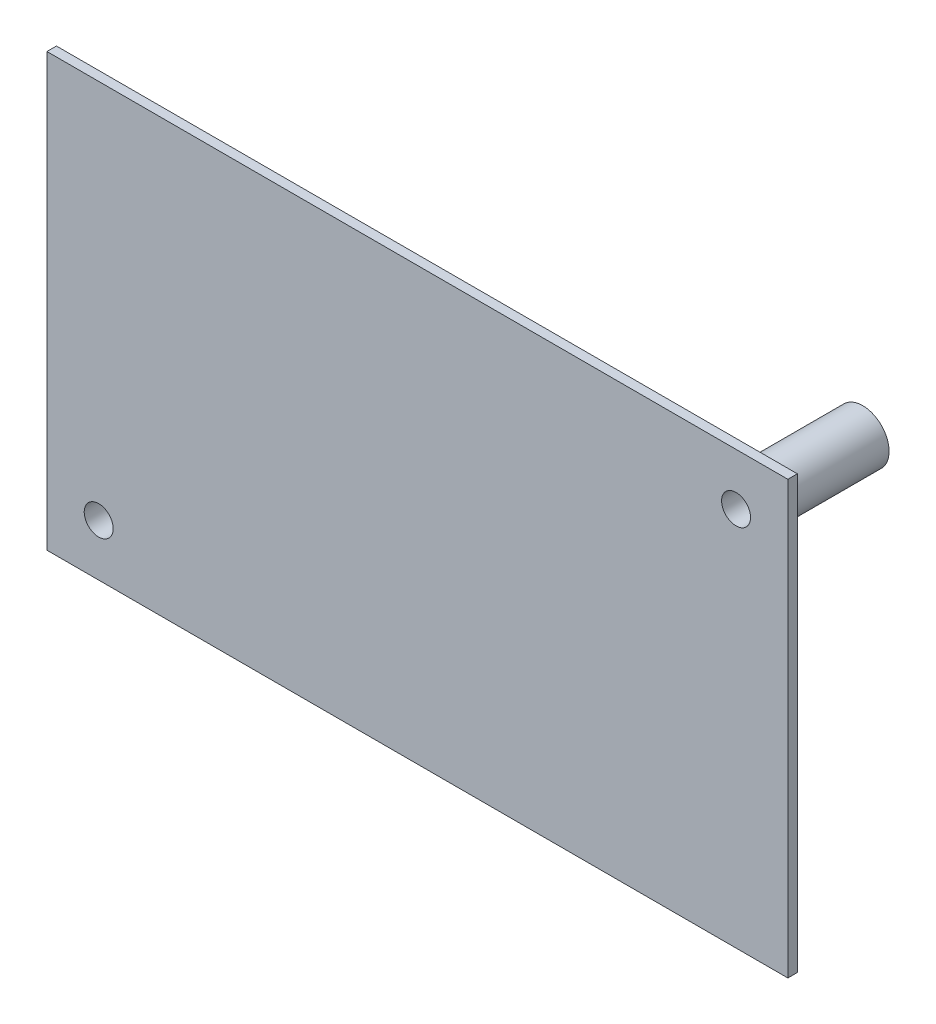
ISO-10303-21;
HEADER;
FILE_DESCRIPTION(('STEP AP214'),'2;1');
FILE_NAME('part.step','',(''),(''),'','','');
FILE_SCHEMA(('AUTOMOTIVE_DESIGN { 1 0 10303 214 1 1 1 1 }'));
ENDSEC;
DATA;
#1=APPLICATION_CONTEXT('core data for automotive mechanical design processes');
#2=APPLICATION_PROTOCOL_DEFINITION('international standard','automotive_design',2000,#1);
#3=PRODUCT_CONTEXT('',#1,'mechanical');
#4=PRODUCT('Part','Part','',(#3));
#5=PRODUCT_RELATED_PRODUCT_CATEGORY('part','',(#4));
#6=PRODUCT_DEFINITION_FORMATION('','',#4);
#7=PRODUCT_DEFINITION_CONTEXT('part definition',#1,'design');
#8=PRODUCT_DEFINITION('design','',#6,#7);
#9=PRODUCT_DEFINITION_SHAPE('','',#8);
#10=(LENGTH_UNIT() NAMED_UNIT(*) SI_UNIT(.MILLI.,.METRE.));
#11=(NAMED_UNIT(*) PLANE_ANGLE_UNIT() SI_UNIT($,.RADIAN.));
#12=(NAMED_UNIT(*) SI_UNIT($,.STERADIAN.) SOLID_ANGLE_UNIT());
#13=UNCERTAINTY_MEASURE_WITH_UNIT(LENGTH_MEASURE(1.E-05),#10,'distance_accuracy_value','');
#14=(GEOMETRIC_REPRESENTATION_CONTEXT(3) GLOBAL_UNCERTAINTY_ASSIGNED_CONTEXT((#13)) GLOBAL_UNIT_ASSIGNED_CONTEXT((#10,
#11,#12)) REPRESENTATION_CONTEXT('',''));
#15=CARTESIAN_POINT('',(0.,0.,0.));
#16=DIRECTION('',(0.,0.,1.));
#17=DIRECTION('',(1.,0.,0.));
#18=AXIS2_PLACEMENT_3D('',#15,#16,#17);
#19=CARTESIAN_POINT('',(0.5,50.3,16.25));
#20=DIRECTION('',(0.,0.,1.));
#21=DIRECTION('',(1.,0.,0.));
#22=AXIS2_PLACEMENT_3D('',#19,#20,#21);
#23=CYLINDRICAL_SURFACE('',#22,1.);
#24=CARTESIAN_POINT('',(0.5,50.3,17.));
#25=DIRECTION('',(0.,0.,1.));
#26=DIRECTION('',(1.,0.,0.));
#27=AXIS2_PLACEMENT_3D('',#24,#25,#26);
#28=CIRCLE('',#27,1.);
#29=CARTESIAN_POINT('',(0.5,51.3,17.));
#30=VERTEX_POINT('',#29);
#31=CARTESIAN_POINT('',(-0.500000000000001,50.3,17.));
#32=VERTEX_POINT('',#31);
#33=EDGE_CURVE('E143',#30,#32,#28,.T.);
#34=ORIENTED_EDGE('',*,*,#33,.F.);
#35=DIRECTION('',(0.,0.,1.));
#36=VECTOR('',#35,1.);
#37=CARTESIAN_POINT('',(0.5,51.3,16.25));
#38=LINE('',#37,#36);
#39=CARTESIAN_POINT('',(0.5,51.3,16.25));
#40=VERTEX_POINT('',#39);
#41=EDGE_CURVE('E53',#40,#30,#38,.T.);
#42=ORIENTED_EDGE('',*,*,#41,.F.);
#43=CARTESIAN_POINT('',(0.5,50.3,16.25));
#44=DIRECTION('',(0.,0.,1.));
#45=DIRECTION('',(1.,0.,0.));
#46=AXIS2_PLACEMENT_3D('',#43,#44,#45);
#47=CIRCLE('',#46,1.);
#48=CARTESIAN_POINT('',(-0.500000000000001,50.3,16.25));
#49=VERTEX_POINT('',#48);
#50=EDGE_CURVE('E173',#40,#49,#47,.T.);
#51=ORIENTED_EDGE('',*,*,#50,.T.);
#52=DIRECTION('',(0.,0.,1.));
#53=VECTOR('',#52,1.);
#54=CARTESIAN_POINT('',(-0.500000000000001,50.3,16.25));
#55=LINE('',#54,#53);
#56=EDGE_CURVE('E95',#49,#32,#55,.T.);
#57=ORIENTED_EDGE('',*,*,#56,.T.);
#58=EDGE_LOOP('',(#34,#42,#51,#57));
#59=FACE_BOUND('',#58,.T.);
#60=ADVANCED_FACE('F36',(#59),#23,.T.);
#61=CARTESIAN_POINT('',(90.94,51.3,16.25));
#62=DIRECTION('',(0.,1.,0.));
#63=DIRECTION('',(0.,0.,1.));
#64=AXIS2_PLACEMENT_3D('',#61,#62,#63);
#65=PLANE('',#64);
#66=DIRECTION('',(-1.,0.,0.));
#67=VECTOR('',#66,1.);
#68=CARTESIAN_POINT('',(90.94,51.3,17.));
#69=LINE('',#68,#67);
#70=CARTESIAN_POINT('',(90.94,51.3,17.));
#71=VERTEX_POINT('',#70);
#72=EDGE_CURVE('E169',#71,#30,#69,.T.);
#73=ORIENTED_EDGE('',*,*,#72,.F.);
#74=DIRECTION('',(0.,0.,1.));
#75=VECTOR('',#74,1.);
#76=CARTESIAN_POINT('',(90.94,51.3,16.25));
#77=LINE('',#76,#75);
#78=CARTESIAN_POINT('',(90.94,51.3,16.25));
#79=VERTEX_POINT('',#78);
#80=EDGE_CURVE('E87',#79,#71,#77,.T.);
#81=ORIENTED_EDGE('',*,*,#80,.F.);
#82=DIRECTION('',(-1.,0.,0.));
#83=VECTOR('',#82,1.);
#84=CARTESIAN_POINT('',(90.94,51.3,16.25));
#85=LINE('',#84,#83);
#86=EDGE_CURVE('E127',#79,#40,#85,.T.);
#87=ORIENTED_EDGE('',*,*,#86,.T.);
#88=ORIENTED_EDGE('',*,*,#41,.T.);
#89=EDGE_LOOP('',(#73,#81,#87,#88));
#90=FACE_BOUND('',#89,.T.);
#91=ADVANCED_FACE('F214',(#90),#65,.T.);
#92=CARTESIAN_POINT('',(90.94,50.3,16.25));
#93=DIRECTION('',(0.,0.,1.));
#94=DIRECTION('',(1.,0.,0.));
#95=AXIS2_PLACEMENT_3D('',#92,#93,#94);
#96=CYLINDRICAL_SURFACE('',#95,1.);
#97=CARTESIAN_POINT('',(90.94,50.3,17.));
#98=DIRECTION('',(0.,0.,1.));
#99=DIRECTION('',(1.,0.,0.));
#100=AXIS2_PLACEMENT_3D('',#97,#98,#99);
#101=CIRCLE('',#100,1.);
#102=CARTESIAN_POINT('',(91.94,50.3,17.));
#103=VERTEX_POINT('',#102);
#104=EDGE_CURVE('E115',#103,#71,#101,.T.);
#105=ORIENTED_EDGE('',*,*,#104,.F.);
#106=DIRECTION('',(0.,0.,1.));
#107=VECTOR('',#106,1.);
#108=CARTESIAN_POINT('',(91.94,50.3,16.25));
#109=LINE('',#108,#107);
#110=CARTESIAN_POINT('',(91.94,50.3,16.25));
#111=VERTEX_POINT('',#110);
#112=EDGE_CURVE('E81',#111,#103,#109,.T.);
#113=ORIENTED_EDGE('',*,*,#112,.F.);
#114=CARTESIAN_POINT('',(90.94,50.3,16.25));
#115=DIRECTION('',(0.,0.,1.));
#116=DIRECTION('',(1.,0.,0.));
#117=AXIS2_PLACEMENT_3D('',#114,#115,#116);
#118=CIRCLE('',#117,1.);
#119=EDGE_CURVE('E112',#111,#79,#118,.T.);
#120=ORIENTED_EDGE('',*,*,#119,.T.);
#121=ORIENTED_EDGE('',*,*,#80,.T.);
#122=EDGE_LOOP('',(#105,#113,#120,#121));
#123=FACE_BOUND('',#122,.T.);
#124=ADVANCED_FACE('F111',(#123),#96,.T.);
#125=CARTESIAN_POINT('',(91.94,0.5,16.25));
#126=DIRECTION('',(1.,0.,0.));
#127=DIRECTION('',(0.,0.,-1.));
#128=AXIS2_PLACEMENT_3D('',#125,#126,#127);
#129=PLANE('',#128);
#130=DIRECTION('',(0.,1.,0.));
#131=VECTOR('',#130,1.);
#132=CARTESIAN_POINT('',(91.94,0.5,17.));
#133=LINE('',#132,#131);
#134=CARTESIAN_POINT('',(91.94,0.5,17.));
#135=VERTEX_POINT('',#134);
#136=EDGE_CURVE('E164',#135,#103,#133,.T.);
#137=ORIENTED_EDGE('',*,*,#136,.F.);
#138=DIRECTION('',(0.,0.,1.));
#139=VECTOR('',#138,1.);
#140=CARTESIAN_POINT('',(91.94,0.5,16.25));
#141=LINE('',#140,#139);
#142=CARTESIAN_POINT('',(91.94,0.5,16.25));
#143=VERTEX_POINT('',#142);
#144=EDGE_CURVE('E118',#143,#135,#141,.T.);
#145=ORIENTED_EDGE('',*,*,#144,.F.);
#146=DIRECTION('',(0.,1.,0.));
#147=VECTOR('',#146,1.);
#148=CARTESIAN_POINT('',(91.94,0.5,16.25));
#149=LINE('',#148,#147);
#150=EDGE_CURVE('E124',#143,#111,#149,.T.);
#151=ORIENTED_EDGE('',*,*,#150,.T.);
#152=ORIENTED_EDGE('',*,*,#112,.T.);
#153=EDGE_LOOP('',(#137,#145,#151,#152));
#154=FACE_BOUND('',#153,.T.);
#155=ADVANCED_FACE('F130',(#154),#129,.T.);
#156=CARTESIAN_POINT('',(90.94,0.5,16.25));
#157=DIRECTION('',(0.,0.,1.));
#158=DIRECTION('',(1.,0.,0.));
#159=AXIS2_PLACEMENT_3D('',#156,#157,#158);
#160=CYLINDRICAL_SURFACE('',#159,1.);
#161=CARTESIAN_POINT('',(90.94,0.5,17.));
#162=DIRECTION('',(0.,0.,1.));
#163=DIRECTION('',(1.,0.,0.));
#164=AXIS2_PLACEMENT_3D('',#161,#162,#163);
#165=CIRCLE('',#164,1.);
#166=CARTESIAN_POINT('',(90.94,-0.500000000000001,17.));
#167=VERTEX_POINT('',#166);
#168=EDGE_CURVE('E160',#167,#135,#165,.T.);
#169=ORIENTED_EDGE('',*,*,#168,.F.);
#170=DIRECTION('',(0.,0.,1.));
#171=VECTOR('',#170,1.);
#172=CARTESIAN_POINT('',(90.94,-0.500000000000001,16.25));
#173=LINE('',#172,#171);
#174=CARTESIAN_POINT('',(90.94,-0.500000000000001,16.25));
#175=VERTEX_POINT('',#174);
#176=EDGE_CURVE('E179',#175,#167,#173,.T.);
#177=ORIENTED_EDGE('',*,*,#176,.F.);
#178=CARTESIAN_POINT('',(90.94,0.5,16.25));
#179=DIRECTION('',(0.,0.,1.));
#180=DIRECTION('',(1.,0.,0.));
#181=AXIS2_PLACEMENT_3D('',#178,#179,#180);
#182=CIRCLE('',#181,1.);
#183=EDGE_CURVE('E132',#175,#143,#182,.T.);
#184=ORIENTED_EDGE('',*,*,#183,.T.);
#185=ORIENTED_EDGE('',*,*,#144,.T.);
#186=EDGE_LOOP('',(#169,#177,#184,#185));
#187=FACE_BOUND('',#186,.T.);
#188=ADVANCED_FACE('F224',(#187),#160,.T.);
#189=CARTESIAN_POINT('',(0.500000000000019,-0.5,16.25));
#190=DIRECTION('',(0.,-1.,0.));
#191=DIRECTION('',(1.,0.,0.));
#192=AXIS2_PLACEMENT_3D('',#189,#190,#191);
#193=PLANE('',#192);
#194=DIRECTION('',(1.,0.,0.));
#195=VECTOR('',#194,1.);
#196=CARTESIAN_POINT('',(0.500000000000019,-0.5,17.));
#197=LINE('',#196,#195);
#198=CARTESIAN_POINT('',(0.500000000000019,-0.5,17.));
#199=VERTEX_POINT('',#198);
#200=EDGE_CURVE('E156',#199,#167,#197,.T.);
#201=ORIENTED_EDGE('',*,*,#200,.F.);
#202=DIRECTION('',(0.,0.,1.));
#203=VECTOR('',#202,1.);
#204=CARTESIAN_POINT('',(0.500000000000019,-0.5,16.25));
#205=LINE('',#204,#203);
#206=CARTESIAN_POINT('',(0.500000000000019,-0.5,16.25));
#207=VERTEX_POINT('',#206);
#208=EDGE_CURVE('E182',#207,#199,#205,.T.);
#209=ORIENTED_EDGE('',*,*,#208,.F.);
#210=DIRECTION('',(1.,0.,0.));
#211=VECTOR('',#210,1.);
#212=CARTESIAN_POINT('',(0.500000000000019,-0.5,16.25));
#213=LINE('',#212,#211);
#214=EDGE_CURVE('E137',#207,#175,#213,.T.);
#215=ORIENTED_EDGE('',*,*,#214,.T.);
#216=ORIENTED_EDGE('',*,*,#176,.T.);
#217=EDGE_LOOP('',(#201,#209,#215,#216));
#218=FACE_BOUND('',#217,.T.);
#219=ADVANCED_FACE('F230',(#218),#193,.T.);
#220=CARTESIAN_POINT('',(0.5,0.5,16.25));
#221=DIRECTION('',(0.,0.,1.));
#222=DIRECTION('',(1.,0.,0.));
#223=AXIS2_PLACEMENT_3D('',#220,#221,#222);
#224=CYLINDRICAL_SURFACE('',#223,1.);
#225=CARTESIAN_POINT('',(0.5,0.5,17.));
#226=DIRECTION('',(0.,0.,1.));
#227=DIRECTION('',(1.,0.,0.));
#228=AXIS2_PLACEMENT_3D('',#225,#226,#227);
#229=CIRCLE('',#228,1.);
#230=CARTESIAN_POINT('',(-0.5,0.5,17.));
#231=VERTEX_POINT('',#230);
#232=EDGE_CURVE('E152',#231,#199,#229,.T.);
#233=ORIENTED_EDGE('',*,*,#232,.F.);
#234=DIRECTION('',(0.,0.,1.));
#235=VECTOR('',#234,1.);
#236=CARTESIAN_POINT('',(-0.5,0.5,16.25));
#237=LINE('',#236,#235);
#238=CARTESIAN_POINT('',(-0.5,0.5,16.25));
#239=VERTEX_POINT('',#238);
#240=EDGE_CURVE('E185',#239,#231,#237,.T.);
#241=ORIENTED_EDGE('',*,*,#240,.F.);
#242=CARTESIAN_POINT('',(0.5,0.5,16.25));
#243=DIRECTION('',(0.,0.,1.));
#244=DIRECTION('',(1.,0.,0.));
#245=AXIS2_PLACEMENT_3D('',#242,#243,#244);
#246=CIRCLE('',#245,1.);
#247=EDGE_CURVE('E232',#239,#207,#246,.T.);
#248=ORIENTED_EDGE('',*,*,#247,.T.);
#249=ORIENTED_EDGE('',*,*,#208,.T.);
#250=EDGE_LOOP('',(#233,#241,#248,#249));
#251=FACE_BOUND('',#250,.T.);
#252=ADVANCED_FACE('F209',(#251),#224,.T.);
#253=CARTESIAN_POINT('',(-0.500000000000001,50.3,16.25));
#254=DIRECTION('',(-1.,0.,0.));
#255=DIRECTION('',(0.,-1.,0.));
#256=AXIS2_PLACEMENT_3D('',#253,#254,#255);
#257=PLANE('',#256);
#258=DIRECTION('',(0.,-1.,0.));
#259=VECTOR('',#258,1.);
#260=CARTESIAN_POINT('',(-0.500000000000001,50.3,17.));
#261=LINE('',#260,#259);
#262=EDGE_CURVE('E147',#32,#231,#261,.T.);
#263=ORIENTED_EDGE('',*,*,#262,.F.);
#264=ORIENTED_EDGE('',*,*,#56,.F.);
#265=DIRECTION('',(0.,-1.,0.));
#266=VECTOR('',#265,1.);
#267=CARTESIAN_POINT('',(-0.500000000000001,50.3,16.25));
#268=LINE('',#267,#266);
#269=EDGE_CURVE('E236',#49,#239,#268,.T.);
#270=ORIENTED_EDGE('',*,*,#269,.T.);
#271=ORIENTED_EDGE('',*,*,#240,.T.);
#272=EDGE_LOOP('',(#263,#264,#270,#271));
#273=FACE_BOUND('',#272,.T.);
#274=ADVANCED_FACE('F199',(#273),#257,.T.);
#275=CARTESIAN_POINT('',(0.5,50.3,16.25));
#276=DIRECTION('',(0.,0.,1.));
#277=DIRECTION('',(1.,0.,0.));
#278=AXIS2_PLACEMENT_3D('',#275,#276,#277);
#279=PLANE('',#278);
#280=CARTESIAN_POINT('',(87.63,46.99,16.2500000000136));
#281=DIRECTION('',(0.,0.,1.));
#282=DIRECTION('',(1.,0.,0.));
#283=AXIS2_PLACEMENT_3D('',#280,#281,#282);
#284=CIRCLE('',#283,3.47265624999999);
#285=CARTESIAN_POINT('',(91.10265625,46.99,16.2500000000136));
#286=VERTEX_POINT('',#285);
#287=EDGE_CURVE('E11',#286,#286,#284,.F.);
#288=ORIENTED_EDGE('',*,*,#287,.F.);
#289=EDGE_LOOP('',(#288));
#290=FACE_BOUND('',#289,.T.);
#291=CARTESIAN_POINT('',(3.81,3.81,16.2500000000136));
#292=DIRECTION('',(0.,0.,1.));
#293=DIRECTION('',(1.,0.,0.));
#294=AXIS2_PLACEMENT_3D('',#291,#292,#293);
#295=CIRCLE('',#294,3.47265625);
#296=CARTESIAN_POINT('',(7.28265625,3.81,16.2500000000136));
#297=VERTEX_POINT('',#296);
#298=EDGE_CURVE('E45',#297,#297,#295,.F.);
#299=ORIENTED_EDGE('',*,*,#298,.F.);
#300=EDGE_LOOP('',(#299));
#301=FACE_BOUND('',#300,.T.);
#302=ORIENTED_EDGE('',*,*,#50,.F.);
#303=ORIENTED_EDGE('',*,*,#86,.F.);
#304=ORIENTED_EDGE('',*,*,#119,.F.);
#305=ORIENTED_EDGE('',*,*,#150,.F.);
#306=ORIENTED_EDGE('',*,*,#183,.F.);
#307=ORIENTED_EDGE('',*,*,#214,.F.);
#308=ORIENTED_EDGE('',*,*,#247,.F.);
#309=ORIENTED_EDGE('',*,*,#269,.F.);
#310=EDGE_LOOP('',(#302,#303,#304,#305,#306,#307,#308,#309));
#311=FACE_BOUND('',#310,.T.);
#312=ADVANCED_FACE('F122',(#290,#301,#311),#279,.F.);
#313=CARTESIAN_POINT('',(0.,0.,17.));
#314=DIRECTION('',(0.,0.,1.));
#315=DIRECTION('',(1.,0.,0.));
#316=AXIS2_PLACEMENT_3D('',#313,#314,#315);
#317=PLANE('',#316);
#318=DIRECTION('',(1.,0.,0.));
#319=VECTOR('',#318,1.);
#320=CARTESIAN_POINT('',(-3.00000000000001,-3.,17.));
#321=LINE('',#320,#319);
#322=CARTESIAN_POINT('',(-3.00000000000001,-3.,17.));
#323=VERTEX_POINT('',#322);
#324=CARTESIAN_POINT('',(94.44,-3.,17.));
#325=VERTEX_POINT('',#324);
#326=EDGE_CURVE('E269',#323,#325,#321,.T.);
#327=ORIENTED_EDGE('',*,*,#326,.F.);
#328=DIRECTION('',(0.,-1.,0.));
#329=VECTOR('',#328,1.);
#330=CARTESIAN_POINT('',(-3.00000000000001,53.8,17.));
#331=LINE('',#330,#329);
#332=CARTESIAN_POINT('',(-3.00000000000001,53.8,17.));
#333=VERTEX_POINT('',#332);
#334=EDGE_CURVE('E257',#333,#323,#331,.T.);
#335=ORIENTED_EDGE('',*,*,#334,.F.);
#336=DIRECTION('',(-1.,0.,0.));
#337=VECTOR('',#336,1.);
#338=CARTESIAN_POINT('',(94.44,53.8,17.));
#339=LINE('',#338,#337);
#340=CARTESIAN_POINT('',(94.44,53.8,17.));
#341=VERTEX_POINT('',#340);
#342=EDGE_CURVE('E261',#341,#333,#339,.T.);
#343=ORIENTED_EDGE('',*,*,#342,.F.);
#344=DIRECTION('',(0.,1.,0.));
#345=VECTOR('',#344,1.);
#346=CARTESIAN_POINT('',(94.44,-3.,17.));
#347=LINE('',#346,#345);
#348=EDGE_CURVE('E265',#325,#341,#347,.T.);
#349=ORIENTED_EDGE('',*,*,#348,.F.);
#350=EDGE_LOOP('',(#327,#335,#343,#349));
#351=FACE_BOUND('',#350,.T.);
#352=ORIENTED_EDGE('',*,*,#72,.T.);
#353=ORIENTED_EDGE('',*,*,#33,.T.);
#354=ORIENTED_EDGE('',*,*,#262,.T.);
#355=ORIENTED_EDGE('',*,*,#232,.T.);
#356=ORIENTED_EDGE('',*,*,#200,.T.);
#357=ORIENTED_EDGE('',*,*,#168,.T.);
#358=ORIENTED_EDGE('',*,*,#136,.T.);
#359=ORIENTED_EDGE('',*,*,#104,.T.);
#360=EDGE_LOOP('',(#352,#353,#354,#355,#356,#357,#358,#359));
#361=FACE_BOUND('',#360,.T.);
#362=ADVANCED_FACE('F198',(#351,#361),#317,.F.);
#363=CARTESIAN_POINT('',(-3.00000000000001,-3.,18.25));
#364=DIRECTION('',(0.,1.,0.));
#365=DIRECTION('',(0.,0.,1.));
#366=AXIS2_PLACEMENT_3D('',#363,#364,#365);
#367=PLANE('',#366);
#368=ORIENTED_EDGE('',*,*,#326,.T.);
#369=DIRECTION('',(0.,0.,-1.));
#370=VECTOR('',#369,1.);
#371=CARTESIAN_POINT('',(94.44,-3.,18.25));
#372=LINE('',#371,#370);
#373=CARTESIAN_POINT('',(94.44,-3.,18.25));
#374=VERTEX_POINT('',#373);
#375=EDGE_CURVE('E148',#374,#325,#372,.T.);
#376=ORIENTED_EDGE('',*,*,#375,.F.);
#377=DIRECTION('',(1.,0.,0.));
#378=VECTOR('',#377,1.);
#379=CARTESIAN_POINT('',(-3.00000000000001,-3.,18.25));
#380=LINE('',#379,#378);
#381=CARTESIAN_POINT('',(-3.00000000000001,-3.,18.25));
#382=VERTEX_POINT('',#381);
#383=EDGE_CURVE('E260',#382,#374,#380,.T.);
#384=ORIENTED_EDGE('',*,*,#383,.F.);
#385=DIRECTION('',(0.,0.,-1.));
#386=VECTOR('',#385,1.);
#387=CARTESIAN_POINT('',(-3.00000000000001,-3.,18.25));
#388=LINE('',#387,#386);
#389=EDGE_CURVE('E252',#382,#323,#388,.T.);
#390=ORIENTED_EDGE('',*,*,#389,.T.);
#391=EDGE_LOOP('',(#368,#376,#384,#390));
#392=FACE_BOUND('',#391,.T.);
#393=ADVANCED_FACE('F206',(#392),#367,.F.);
#394=CARTESIAN_POINT('',(94.44,-3.,18.25));
#395=DIRECTION('',(-1.,0.,0.));
#396=DIRECTION('',(0.,0.,1.));
#397=AXIS2_PLACEMENT_3D('',#394,#395,#396);
#398=PLANE('',#397);
#399=ORIENTED_EDGE('',*,*,#348,.T.);
#400=DIRECTION('',(0.,0.,-1.));
#401=VECTOR('',#400,1.);
#402=CARTESIAN_POINT('',(94.44,53.8,18.25));
#403=LINE('',#402,#401);
#404=CARTESIAN_POINT('',(94.44,53.8,18.25));
#405=VERTEX_POINT('',#404);
#406=EDGE_CURVE('E244',#405,#341,#403,.T.);
#407=ORIENTED_EDGE('',*,*,#406,.F.);
#408=DIRECTION('',(0.,1.,0.));
#409=VECTOR('',#408,1.);
#410=CARTESIAN_POINT('',(94.44,-3.,18.25));
#411=LINE('',#410,#409);
#412=EDGE_CURVE('E280',#374,#405,#411,.T.);
#413=ORIENTED_EDGE('',*,*,#412,.F.);
#414=ORIENTED_EDGE('',*,*,#375,.T.);
#415=EDGE_LOOP('',(#399,#407,#413,#414));
#416=FACE_BOUND('',#415,.T.);
#417=ADVANCED_FACE('F345',(#416),#398,.F.);
#418=CARTESIAN_POINT('',(94.44,53.8,18.25));
#419=DIRECTION('',(0.,-1.,0.));
#420=DIRECTION('',(0.,0.,-1.));
#421=AXIS2_PLACEMENT_3D('',#418,#419,#420);
#422=PLANE('',#421);
#423=ORIENTED_EDGE('',*,*,#342,.T.);
#424=DIRECTION('',(0.,0.,-1.));
#425=VECTOR('',#424,1.);
#426=CARTESIAN_POINT('',(-3.00000000000001,53.8,18.25));
#427=LINE('',#426,#425);
#428=CARTESIAN_POINT('',(-3.00000000000001,53.8,18.25));
#429=VERTEX_POINT('',#428);
#430=EDGE_CURVE('E248',#429,#333,#427,.T.);
#431=ORIENTED_EDGE('',*,*,#430,.F.);
#432=DIRECTION('',(-1.,0.,0.));
#433=VECTOR('',#432,1.);
#434=CARTESIAN_POINT('',(94.44,53.8,18.25));
#435=LINE('',#434,#433);
#436=EDGE_CURVE('E276',#405,#429,#435,.T.);
#437=ORIENTED_EDGE('',*,*,#436,.F.);
#438=ORIENTED_EDGE('',*,*,#406,.T.);
#439=EDGE_LOOP('',(#423,#431,#437,#438));
#440=FACE_BOUND('',#439,.T.);
#441=ADVANCED_FACE('F339',(#440),#422,.F.);
#442=CARTESIAN_POINT('',(-3.00000000000001,53.8,18.25));
#443=DIRECTION('',(1.,0.,0.));
#444=DIRECTION('',(0.,0.,-1.));
#445=AXIS2_PLACEMENT_3D('',#442,#443,#444);
#446=PLANE('',#445);
#447=ORIENTED_EDGE('',*,*,#334,.T.);
#448=ORIENTED_EDGE('',*,*,#389,.F.);
#449=DIRECTION('',(0.,-1.,0.));
#450=VECTOR('',#449,1.);
#451=CARTESIAN_POINT('',(-3.00000000000001,53.8,18.25));
#452=LINE('',#451,#450);
#453=EDGE_CURVE('E256',#429,#382,#452,.T.);
#454=ORIENTED_EDGE('',*,*,#453,.F.);
#455=ORIENTED_EDGE('',*,*,#430,.T.);
#456=EDGE_LOOP('',(#447,#448,#454,#455));
#457=FACE_BOUND('',#456,.T.);
#458=ADVANCED_FACE('F331',(#457),#446,.F.);
#459=CARTESIAN_POINT('',(0.,0.,18.25));
#460=DIRECTION('',(0.,0.,1.));
#461=DIRECTION('',(1.,0.,0.));
#462=AXIS2_PLACEMENT_3D('',#459,#460,#461);
#463=PLANE('',#462);
#464=CARTESIAN_POINT('',(3.81,3.81,18.25));
#465=DIRECTION('',(0.,0.,1.));
#466=DIRECTION('',(1.,0.,0.));
#467=AXIS2_PLACEMENT_3D('',#464,#465,#466);
#468=CIRCLE('',#467,1.905);
#469=CARTESIAN_POINT('',(5.715,3.81,18.25));
#470=VERTEX_POINT('',#469);
#471=EDGE_CURVE('E298',#470,#470,#468,.F.);
#472=ORIENTED_EDGE('',*,*,#471,.T.);
#473=EDGE_LOOP('',(#472));
#474=FACE_BOUND('',#473,.T.);
#475=CARTESIAN_POINT('',(87.63,46.99,18.25));
#476=DIRECTION('',(0.,0.,1.));
#477=DIRECTION('',(1.,0.,0.));
#478=AXIS2_PLACEMENT_3D('',#475,#476,#477);
#479=CIRCLE('',#478,1.90500000000001);
#480=CARTESIAN_POINT('',(89.535,46.99,18.25));
#481=VERTEX_POINT('',#480);
#482=EDGE_CURVE('E302',#481,#481,#479,.F.);
#483=ORIENTED_EDGE('',*,*,#482,.T.);
#484=EDGE_LOOP('',(#483));
#485=FACE_BOUND('',#484,.T.);
#486=ORIENTED_EDGE('',*,*,#383,.T.);
#487=ORIENTED_EDGE('',*,*,#412,.T.);
#488=ORIENTED_EDGE('',*,*,#436,.T.);
#489=ORIENTED_EDGE('',*,*,#453,.T.);
#490=EDGE_LOOP('',(#486,#487,#488,#489));
#491=FACE_BOUND('',#490,.T.);
#492=ADVANCED_FACE('F310',(#474,#485,#491),#463,.T.);
#493=CARTESIAN_POINT('',(3.81,3.81,1.6));
#494=DIRECTION('',(0.,0.,1.));
#495=DIRECTION('',(1.,0.,0.));
#496=AXIS2_PLACEMENT_3D('',#493,#494,#495);
#497=PLANE('',#496);
#498=CARTESIAN_POINT('',(3.81,3.81,1.6));
#499=DIRECTION('',(0.,0.,1.));
#500=DIRECTION('',(1.,0.,0.));
#501=AXIS2_PLACEMENT_3D('',#498,#499,#500);
#502=CIRCLE('',#501,1.905);
#503=CARTESIAN_POINT('',(5.715,3.81,1.6));
#504=VERTEX_POINT('',#503);
#505=EDGE_CURVE('E287',#504,#504,#502,.T.);
#506=ORIENTED_EDGE('',*,*,#505,.T.);
#507=EDGE_LOOP('',(#506));
#508=FACE_BOUND('',#507,.T.);
#509=CARTESIAN_POINT('',(3.81,3.81,1.6));
#510=DIRECTION('',(0.,0.,1.));
#511=DIRECTION('',(1.,0.,0.));
#512=AXIS2_PLACEMENT_3D('',#509,#510,#511);
#513=CIRCLE('',#512,3.47265625);
#514=CARTESIAN_POINT('',(7.28265625,3.81,1.6));
#515=VERTEX_POINT('',#514);
#516=EDGE_CURVE('E272',#515,#515,#513,.T.);
#517=ORIENTED_EDGE('',*,*,#516,.F.);
#518=EDGE_LOOP('',(#517));
#519=FACE_BOUND('',#518,.T.);
#520=ADVANCED_FACE('F325',(#508,#519),#497,.F.);
#521=CARTESIAN_POINT('',(3.81,3.81,500000.));
#522=DIRECTION('',(0.,0.,-1.));
#523=DIRECTION('',(-1.,0.,0.));
#524=AXIS2_PLACEMENT_3D('',#521,#522,#523);
#525=CYLINDRICAL_SURFACE('',#524,3.47265625);
#526=ORIENTED_EDGE('',*,*,#516,.T.);
#527=EDGE_LOOP('',(#526));
#528=FACE_BOUND('',#527,.T.);
#529=ORIENTED_EDGE('',*,*,#298,.T.);
#530=EDGE_LOOP('',(#529));
#531=FACE_BOUND('',#530,.T.);
#532=ADVANCED_FACE('F195',(#528,#531),#525,.T.);
#533=CARTESIAN_POINT('',(3.81,3.81,500000.));
#534=DIRECTION('',(0.,0.,-1.));
#535=DIRECTION('',(-1.,0.,0.));
#536=AXIS2_PLACEMENT_3D('',#533,#534,#535);
#537=CYLINDRICAL_SURFACE('',#536,1.905);
#538=ORIENTED_EDGE('',*,*,#505,.F.);
#539=EDGE_LOOP('',(#538));
#540=FACE_BOUND('',#539,.T.);
#541=ORIENTED_EDGE('',*,*,#471,.F.);
#542=EDGE_LOOP('',(#541));
#543=FACE_BOUND('',#542,.T.);
#544=ADVANCED_FACE('F313',(#540,#543),#537,.F.);
#545=CARTESIAN_POINT('',(87.63,46.99,1.6));
#546=DIRECTION('',(0.,0.,1.));
#547=DIRECTION('',(1.,0.,0.));
#548=AXIS2_PLACEMENT_3D('',#545,#546,#547);
#549=PLANE('',#548);
#550=CARTESIAN_POINT('',(87.63,46.99,1.6));
#551=DIRECTION('',(0.,0.,1.));
#552=DIRECTION('',(1.,0.,0.));
#553=AXIS2_PLACEMENT_3D('',#550,#551,#552);
#554=CIRCLE('',#553,1.90500000000001);
#555=CARTESIAN_POINT('',(89.535,46.99,1.6));
#556=VERTEX_POINT('',#555);
#557=EDGE_CURVE('E295',#556,#556,#554,.T.);
#558=ORIENTED_EDGE('',*,*,#557,.T.);
#559=EDGE_LOOP('',(#558));
#560=FACE_BOUND('',#559,.T.);
#561=CARTESIAN_POINT('',(87.63,46.99,1.6));
#562=DIRECTION('',(0.,0.,1.));
#563=DIRECTION('',(1.,0.,0.));
#564=AXIS2_PLACEMENT_3D('',#561,#562,#563);
#565=CIRCLE('',#564,3.47265624999999);
#566=CARTESIAN_POINT('',(91.10265625,46.99,1.6));
#567=VERTEX_POINT('',#566);
#568=EDGE_CURVE('E291',#567,#567,#565,.T.);
#569=ORIENTED_EDGE('',*,*,#568,.F.);
#570=EDGE_LOOP('',(#569));
#571=FACE_BOUND('',#570,.T.);
#572=ADVANCED_FACE('F315',(#560,#571),#549,.F.);
#573=CARTESIAN_POINT('',(87.63,46.99,500000.));
#574=DIRECTION('',(0.,0.,-1.));
#575=DIRECTION('',(-1.,0.,0.));
#576=AXIS2_PLACEMENT_3D('',#573,#574,#575);
#577=CYLINDRICAL_SURFACE('',#576,3.47265624999999);
#578=ORIENTED_EDGE('',*,*,#568,.T.);
#579=EDGE_LOOP('',(#578));
#580=FACE_BOUND('',#579,.T.);
#581=ORIENTED_EDGE('',*,*,#287,.T.);
#582=EDGE_LOOP('',(#581));
#583=FACE_BOUND('',#582,.T.);
#584=ADVANCED_FACE('F322',(#580,#583),#577,.T.);
#585=CARTESIAN_POINT('',(87.63,46.99,500000.));
#586=DIRECTION('',(0.,0.,-1.));
#587=DIRECTION('',(-1.,0.,0.));
#588=AXIS2_PLACEMENT_3D('',#585,#586,#587);
#589=CYLINDRICAL_SURFACE('',#588,1.90500000000001);
#590=ORIENTED_EDGE('',*,*,#557,.F.);
#591=EDGE_LOOP('',(#590));
#592=FACE_BOUND('',#591,.T.);
#593=ORIENTED_EDGE('',*,*,#482,.F.);
#594=EDGE_LOOP('',(#593));
#595=FACE_BOUND('',#594,.T.);
#596=ADVANCED_FACE('F338',(#592,#595),#589,.F.);
#597=CLOSED_SHELL('',(#60,#91,#124,#155,#188,#219,#252,#274,#312,#362,#393,#417,#441,#458,#492,
#520,#532,#544,#572,#584,#596));
#598=MANIFOLD_SOLID_BREP('B2',#597);
#599=ADVANCED_BREP_SHAPE_REPRESENTATION('',(#18,#598),#14);
#600=SHAPE_DEFINITION_REPRESENTATION(#9,#599);
ENDSEC;
END-ISO-10303-21;
